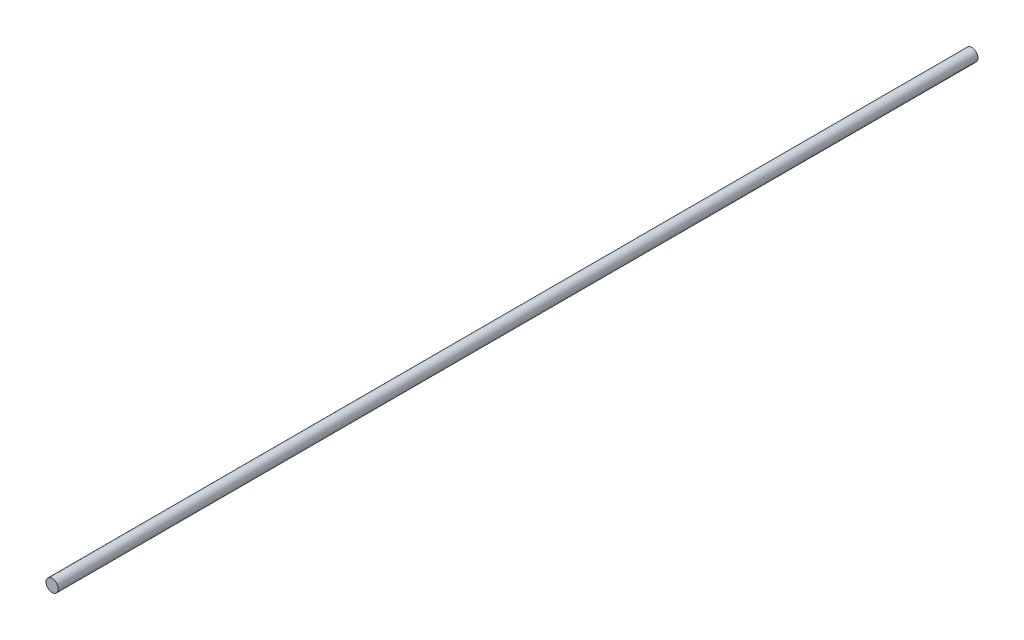
ISO-10303-21;
HEADER;
FILE_DESCRIPTION(('STEP AP214'),'2;1');
FILE_NAME('part.step','',(''),(''),'','','');
FILE_SCHEMA(('AUTOMOTIVE_DESIGN { 1 0 10303 214 1 1 1 1 }'));
ENDSEC;
DATA;
#1=APPLICATION_CONTEXT('core data for automotive mechanical design processes');
#2=APPLICATION_PROTOCOL_DEFINITION('international standard','automotive_design',2000,#1);
#3=PRODUCT_CONTEXT('',#1,'mechanical');
#4=PRODUCT('Part','Part','',(#3));
#5=PRODUCT_RELATED_PRODUCT_CATEGORY('part','',(#4));
#6=PRODUCT_DEFINITION_FORMATION('','',#4);
#7=PRODUCT_DEFINITION_CONTEXT('part definition',#1,'design');
#8=PRODUCT_DEFINITION('design','',#6,#7);
#9=PRODUCT_DEFINITION_SHAPE('','',#8);
#10=(LENGTH_UNIT() NAMED_UNIT(*) SI_UNIT(.MILLI.,.METRE.));
#11=(NAMED_UNIT(*) PLANE_ANGLE_UNIT() SI_UNIT($,.RADIAN.));
#12=(NAMED_UNIT(*) SI_UNIT($,.STERADIAN.) SOLID_ANGLE_UNIT());
#13=UNCERTAINTY_MEASURE_WITH_UNIT(LENGTH_MEASURE(1.E-05),#10,'distance_accuracy_value','');
#14=(GEOMETRIC_REPRESENTATION_CONTEXT(3) GLOBAL_UNCERTAINTY_ASSIGNED_CONTEXT((#13)) GLOBAL_UNIT_ASSIGNED_CONTEXT((#10,
#11,#12)) REPRESENTATION_CONTEXT('',''));
#15=CARTESIAN_POINT('',(0.,0.,0.));
#16=DIRECTION('',(0.,0.,1.));
#17=DIRECTION('',(1.,0.,0.));
#18=AXIS2_PLACEMENT_3D('',#15,#16,#17);
#19=CARTESIAN_POINT('',(0.,0.,-20.));
#20=DIRECTION('',(0.,0.,1.));
#21=DIRECTION('',(1.,0.,0.));
#22=AXIS2_PLACEMENT_3D('',#19,#20,#21);
#23=CYLINDRICAL_SURFACE('',#22,10.);
#24=CARTESIAN_POINT('',(0.,0.,-20.));
#25=DIRECTION('',(0.,0.,1.));
#26=DIRECTION('',(1.,0.,0.));
#27=AXIS2_PLACEMENT_3D('',#24,#25,#26);
#28=CIRCLE('',#27,10.);
#29=CARTESIAN_POINT('',(10.,0.,-20.));
#30=VERTEX_POINT('',#29);
#31=EDGE_CURVE('E10',#30,#30,#28,.T.);
#32=ORIENTED_EDGE('',*,*,#31,.T.);
#33=EDGE_LOOP('',(#32));
#34=FACE_BOUND('',#33,.T.);
#35=CARTESIAN_POINT('',(0.,0.,1480.));
#36=DIRECTION('',(0.,0.,1.));
#37=DIRECTION('',(1.,0.,0.));
#38=AXIS2_PLACEMENT_3D('',#35,#36,#37);
#39=CIRCLE('',#38,10.);
#40=CARTESIAN_POINT('',(10.,0.,1480.));
#41=VERTEX_POINT('',#40);
#42=EDGE_CURVE('E36',#41,#41,#39,.T.);
#43=ORIENTED_EDGE('',*,*,#42,.F.);
#44=EDGE_LOOP('',(#43));
#45=FACE_BOUND('',#44,.T.);
#46=ADVANCED_FACE('F30',(#34,#45),#23,.T.);
#47=CARTESIAN_POINT('',(0.,0.,-20.));
#48=DIRECTION('',(0.,0.,1.));
#49=DIRECTION('',(1.,0.,0.));
#50=AXIS2_PLACEMENT_3D('',#47,#48,#49);
#51=PLANE('',#50);
#52=ORIENTED_EDGE('',*,*,#31,.F.);
#53=EDGE_LOOP('',(#52));
#54=FACE_BOUND('',#53,.T.);
#55=ADVANCED_FACE('F45',(#54),#51,.F.);
#56=CARTESIAN_POINT('',(0.,0.,1480.));
#57=DIRECTION('',(0.,0.,1.));
#58=DIRECTION('',(1.,0.,0.));
#59=AXIS2_PLACEMENT_3D('',#56,#57,#58);
#60=PLANE('',#59);
#61=ORIENTED_EDGE('',*,*,#42,.T.);
#62=EDGE_LOOP('',(#61));
#63=FACE_BOUND('',#62,.T.);
#64=ADVANCED_FACE('F42',(#63),#60,.T.);
#65=CLOSED_SHELL('',(#46,#55,#64));
#66=MANIFOLD_SOLID_BREP('B2',#65);
#67=ADVANCED_BREP_SHAPE_REPRESENTATION('',(#18,#66),#14);
#68=SHAPE_DEFINITION_REPRESENTATION(#9,#67);
ENDSEC;
END-ISO-10303-21;
